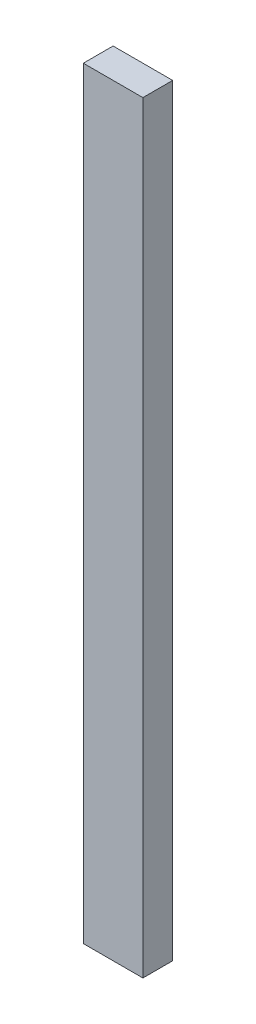
ISO-10303-21;
HEADER;
FILE_DESCRIPTION(('STEP AP214'),'2;1');
FILE_NAME('part.step','',(''),(''),'','','');
FILE_SCHEMA(('AUTOMOTIVE_DESIGN { 1 0 10303 214 1 1 1 1 }'));
ENDSEC;
DATA;
#1=APPLICATION_CONTEXT('core data for automotive mechanical design processes');
#2=APPLICATION_PROTOCOL_DEFINITION('international standard','automotive_design',2000,#1);
#3=PRODUCT_CONTEXT('',#1,'mechanical');
#4=PRODUCT('Part','Part','',(#3));
#5=PRODUCT_RELATED_PRODUCT_CATEGORY('part','',(#4));
#6=PRODUCT_DEFINITION_FORMATION('','',#4);
#7=PRODUCT_DEFINITION_CONTEXT('part definition',#1,'design');
#8=PRODUCT_DEFINITION('design','',#6,#7);
#9=PRODUCT_DEFINITION_SHAPE('','',#8);
#10=(LENGTH_UNIT() NAMED_UNIT(*) SI_UNIT(.MILLI.,.METRE.));
#11=(NAMED_UNIT(*) PLANE_ANGLE_UNIT() SI_UNIT($,.RADIAN.));
#12=(NAMED_UNIT(*) SI_UNIT($,.STERADIAN.) SOLID_ANGLE_UNIT());
#13=UNCERTAINTY_MEASURE_WITH_UNIT(LENGTH_MEASURE(1.E-05),#10,'distance_accuracy_value','');
#14=(GEOMETRIC_REPRESENTATION_CONTEXT(3) GLOBAL_UNCERTAINTY_ASSIGNED_CONTEXT((#13)) GLOBAL_UNIT_ASSIGNED_CONTEXT((#10,
#11,#12)) REPRESENTATION_CONTEXT('',''));
#15=CARTESIAN_POINT('',(0.,0.,0.));
#16=DIRECTION('',(0.,0.,1.));
#17=DIRECTION('',(1.,0.,0.));
#18=AXIS2_PLACEMENT_3D('',#15,#16,#17);
#19=CARTESIAN_POINT('',(15.,-4.,20.));
#20=DIRECTION('',(1.,0.,0.));
#21=DIRECTION('',(0.,0.,-1.));
#22=AXIS2_PLACEMENT_3D('',#19,#20,#21);
#23=PLANE('',#22);
#24=DIRECTION('',(0.,-1.,0.));
#25=VECTOR('',#24,1.);
#26=CARTESIAN_POINT('',(15.,-4.,0.));
#27=LINE('',#26,#25);
#28=CARTESIAN_POINT('',(15.,-4.,0.));
#29=VERTEX_POINT('',#28);
#30=CARTESIAN_POINT('',(15.,-516.,0.));
#31=VERTEX_POINT('',#30);
#32=EDGE_CURVE('E95',#29,#31,#27,.T.);
#33=ORIENTED_EDGE('',*,*,#32,.T.);
#34=DIRECTION('',(0.,0.,-1.));
#35=VECTOR('',#34,1.);
#36=CARTESIAN_POINT('',(15.,-516.,20.));
#37=LINE('',#36,#35);
#38=CARTESIAN_POINT('',(15.,-516.,20.));
#39=VERTEX_POINT('',#38);
#40=EDGE_CURVE('E11',#39,#31,#37,.T.);
#41=ORIENTED_EDGE('',*,*,#40,.F.);
#42=DIRECTION('',(0.,-1.,0.));
#43=VECTOR('',#42,1.);
#44=CARTESIAN_POINT('',(15.,-4.,20.));
#45=LINE('',#44,#43);
#46=CARTESIAN_POINT('',(15.,-4.,20.));
#47=VERTEX_POINT('',#46);
#48=EDGE_CURVE('E83',#47,#39,#45,.T.);
#49=ORIENTED_EDGE('',*,*,#48,.F.);
#50=DIRECTION('',(0.,0.,-1.));
#51=VECTOR('',#50,1.);
#52=CARTESIAN_POINT('',(15.,-4.,20.));
#53=LINE('',#52,#51);
#54=EDGE_CURVE('E91',#47,#29,#53,.T.);
#55=ORIENTED_EDGE('',*,*,#54,.T.);
#56=EDGE_LOOP('',(#33,#41,#49,#55));
#57=FACE_BOUND('',#56,.T.);
#58=ADVANCED_FACE('F32',(#57),#23,.F.);
#59=CARTESIAN_POINT('',(55.,-516.,20.));
#60=DIRECTION('',(0.,1.,0.));
#61=DIRECTION('',(0.,0.,1.));
#62=AXIS2_PLACEMENT_3D('',#59,#60,#61);
#63=PLANE('',#62);
#64=DIRECTION('',(1.,0.,0.));
#65=VECTOR('',#64,1.);
#66=CARTESIAN_POINT('',(55.,-516.,0.));
#67=LINE('',#66,#65);
#68=CARTESIAN_POINT('',(55.,-516.,0.));
#69=VERTEX_POINT('',#68);
#70=EDGE_CURVE('E87',#31,#69,#67,.T.);
#71=ORIENTED_EDGE('',*,*,#70,.T.);
#72=DIRECTION('',(0.,0.,-1.));
#73=VECTOR('',#72,1.);
#74=CARTESIAN_POINT('',(55.,-516.,20.));
#75=LINE('',#74,#73);
#76=CARTESIAN_POINT('',(55.,-516.,20.));
#77=VERTEX_POINT('',#76);
#78=EDGE_CURVE('E40',#77,#69,#75,.T.);
#79=ORIENTED_EDGE('',*,*,#78,.F.);
#80=DIRECTION('',(1.,0.,0.));
#81=VECTOR('',#80,1.);
#82=CARTESIAN_POINT('',(55.,-516.,20.));
#83=LINE('',#82,#81);
#84=EDGE_CURVE('E78',#39,#77,#83,.T.);
#85=ORIENTED_EDGE('',*,*,#84,.F.);
#86=ORIENTED_EDGE('',*,*,#40,.T.);
#87=EDGE_LOOP('',(#71,#79,#85,#86));
#88=FACE_BOUND('',#87,.T.);
#89=ADVANCED_FACE('F86',(#88),#63,.F.);
#90=CARTESIAN_POINT('',(55.,-4.,20.));
#91=DIRECTION('',(-1.,0.,0.));
#92=DIRECTION('',(0.,0.,1.));
#93=AXIS2_PLACEMENT_3D('',#90,#91,#92);
#94=PLANE('',#93);
#95=DIRECTION('',(0.,1.,0.));
#96=VECTOR('',#95,1.);
#97=CARTESIAN_POINT('',(55.,-4.,0.));
#98=LINE('',#97,#96);
#99=CARTESIAN_POINT('',(55.,-4.,0.));
#100=VERTEX_POINT('',#99);
#101=EDGE_CURVE('E65',#69,#100,#98,.T.);
#102=ORIENTED_EDGE('',*,*,#101,.T.);
#103=DIRECTION('',(0.,0.,-1.));
#104=VECTOR('',#103,1.);
#105=CARTESIAN_POINT('',(55.,-4.,20.));
#106=LINE('',#105,#104);
#107=CARTESIAN_POINT('',(55.,-4.,20.));
#108=VERTEX_POINT('',#107);
#109=EDGE_CURVE('E88',#108,#100,#106,.T.);
#110=ORIENTED_EDGE('',*,*,#109,.F.);
#111=DIRECTION('',(0.,1.,0.));
#112=VECTOR('',#111,1.);
#113=CARTESIAN_POINT('',(55.,-4.,20.));
#114=LINE('',#113,#112);
#115=EDGE_CURVE('E81',#77,#108,#114,.T.);
#116=ORIENTED_EDGE('',*,*,#115,.F.);
#117=ORIENTED_EDGE('',*,*,#78,.T.);
#118=EDGE_LOOP('',(#102,#110,#116,#117));
#119=FACE_BOUND('',#118,.T.);
#120=ADVANCED_FACE('F89',(#119),#94,.F.);
#121=CARTESIAN_POINT('',(55.,-4.,20.));
#122=DIRECTION('',(0.,-1.,0.));
#123=DIRECTION('',(0.,0.,-1.));
#124=AXIS2_PLACEMENT_3D('',#121,#122,#123);
#125=PLANE('',#124);
#126=DIRECTION('',(-1.,0.,0.));
#127=VECTOR('',#126,1.);
#128=CARTESIAN_POINT('',(55.,-4.,0.));
#129=LINE('',#128,#127);
#130=EDGE_CURVE('E71',#100,#29,#129,.T.);
#131=ORIENTED_EDGE('',*,*,#130,.T.);
#132=ORIENTED_EDGE('',*,*,#54,.F.);
#133=DIRECTION('',(-1.,0.,0.));
#134=VECTOR('',#133,1.);
#135=CARTESIAN_POINT('',(55.,-4.,20.));
#136=LINE('',#135,#134);
#137=EDGE_CURVE('E48',#108,#47,#136,.T.);
#138=ORIENTED_EDGE('',*,*,#137,.F.);
#139=ORIENTED_EDGE('',*,*,#109,.T.);
#140=EDGE_LOOP('',(#131,#132,#138,#139));
#141=FACE_BOUND('',#140,.T.);
#142=ADVANCED_FACE('F102',(#141),#125,.F.);
#143=CARTESIAN_POINT('',(0.,0.,20.));
#144=DIRECTION('',(0.,0.,-1.));
#145=DIRECTION('',(-1.,0.,0.));
#146=AXIS2_PLACEMENT_3D('',#143,#144,#145);
#147=PLANE('',#146);
#148=ORIENTED_EDGE('',*,*,#48,.T.);
#149=ORIENTED_EDGE('',*,*,#84,.T.);
#150=ORIENTED_EDGE('',*,*,#115,.T.);
#151=ORIENTED_EDGE('',*,*,#137,.T.);
#152=EDGE_LOOP('',(#148,#149,#150,#151));
#153=FACE_BOUND('',#152,.T.);
#154=ADVANCED_FACE('F79',(#153),#147,.F.);
#155=CARTESIAN_POINT('',(0.,0.,0.));
#156=DIRECTION('',(0.,0.,-1.));
#157=DIRECTION('',(-1.,0.,0.));
#158=AXIS2_PLACEMENT_3D('',#155,#156,#157);
#159=PLANE('',#158);
#160=ORIENTED_EDGE('',*,*,#32,.F.);
#161=ORIENTED_EDGE('',*,*,#130,.F.);
#162=ORIENTED_EDGE('',*,*,#101,.F.);
#163=ORIENTED_EDGE('',*,*,#70,.F.);
#164=EDGE_LOOP('',(#160,#161,#162,#163));
#165=FACE_BOUND('',#164,.T.);
#166=ADVANCED_FACE('F105',(#165),#159,.T.);
#167=CLOSED_SHELL('',(#58,#89,#120,#142,#154,#166));
#168=MANIFOLD_SOLID_BREP('B2',#167);
#169=ADVANCED_BREP_SHAPE_REPRESENTATION('',(#18,#168),#14);
#170=SHAPE_DEFINITION_REPRESENTATION(#9,#169);
ENDSEC;
END-ISO-10303-21;
